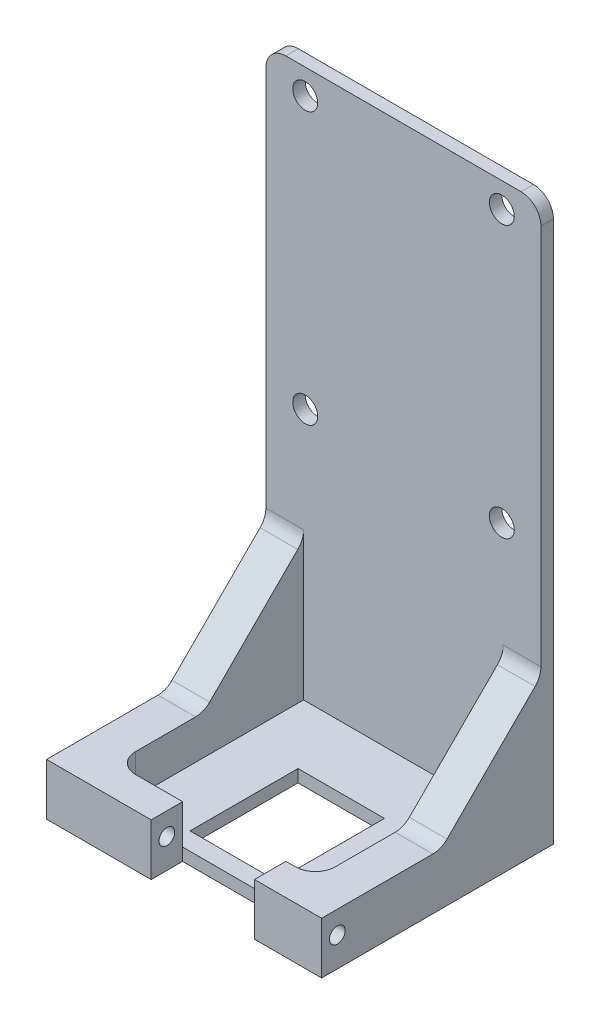
ISO-10303-21;
HEADER;
FILE_DESCRIPTION(('STEP AP214'),'2;1');
FILE_NAME('part.step','',(''),(''),'','','');
FILE_SCHEMA(('AUTOMOTIVE_DESIGN { 1 0 10303 214 1 1 1 1 }'));
ENDSEC;
DATA;
#1=APPLICATION_CONTEXT('core data for automotive mechanical design processes');
#2=APPLICATION_PROTOCOL_DEFINITION('international standard','automotive_design',2000,#1);
#3=PRODUCT_CONTEXT('',#1,'mechanical');
#4=PRODUCT('Part','Part','',(#3));
#5=PRODUCT_RELATED_PRODUCT_CATEGORY('part','',(#4));
#6=PRODUCT_DEFINITION_FORMATION('','',#4);
#7=PRODUCT_DEFINITION_CONTEXT('part definition',#1,'design');
#8=PRODUCT_DEFINITION('design','',#6,#7);
#9=PRODUCT_DEFINITION_SHAPE('','',#8);
#10=(LENGTH_UNIT() NAMED_UNIT(*) SI_UNIT(.MILLI.,.METRE.));
#11=(NAMED_UNIT(*) PLANE_ANGLE_UNIT() SI_UNIT($,.RADIAN.));
#12=(NAMED_UNIT(*) SI_UNIT($,.STERADIAN.) SOLID_ANGLE_UNIT());
#13=UNCERTAINTY_MEASURE_WITH_UNIT(LENGTH_MEASURE(1.E-05),#10,'distance_accuracy_value','');
#14=(GEOMETRIC_REPRESENTATION_CONTEXT(3) GLOBAL_UNCERTAINTY_ASSIGNED_CONTEXT((#13)) GLOBAL_UNIT_ASSIGNED_CONTEXT((#10,
#11,#12)) REPRESENTATION_CONTEXT('',''));
#15=CARTESIAN_POINT('',(0.,0.,0.));
#16=DIRECTION('',(0.,0.,1.));
#17=DIRECTION('',(1.,0.,0.));
#18=AXIS2_PLACEMENT_3D('',#15,#16,#17);
#19=CARTESIAN_POINT('',(0.,3.175,0.));
#20=DIRECTION('',(0.,-1.,0.));
#21=DIRECTION('',(0.,0.,-1.));
#22=AXIS2_PLACEMENT_3D('',#19,#20,#21);
#23=PLANE('',#22);
#24=DIRECTION('',(1.,0.,0.));
#25=VECTOR('',#24,1.);
#26=CARTESIAN_POINT('',(-11.,3.175,17.));
#27=LINE('',#26,#25);
#28=CARTESIAN_POINT('',(-11.,3.175,17.));
#29=VERTEX_POINT('',#28);
#30=CARTESIAN_POINT('',(11.,3.175,17.));
#31=VERTEX_POINT('',#30);
#32=EDGE_CURVE('E239',#29,#31,#27,.T.);
#33=ORIENTED_EDGE('',*,*,#32,.F.);
#34=DIRECTION('',(0.,0.,1.));
#35=VECTOR('',#34,1.);
#36=CARTESIAN_POINT('',(-11.,3.175,17.));
#37=LINE('',#36,#35);
#38=CARTESIAN_POINT('',(-11.,3.175,-10.5));
#39=VERTEX_POINT('',#38);
#40=EDGE_CURVE('E244',#39,#29,#37,.T.);
#41=ORIENTED_EDGE('',*,*,#40,.F.);
#42=DIRECTION('',(-1.,0.,0.));
#43=VECTOR('',#42,1.);
#44=CARTESIAN_POINT('',(-11.,3.175,-10.5));
#45=LINE('',#44,#43);
#46=CARTESIAN_POINT('',(11.,3.175,-10.5));
#47=VERTEX_POINT('',#46);
#48=EDGE_CURVE('E248',#47,#39,#45,.T.);
#49=ORIENTED_EDGE('',*,*,#48,.F.);
#50=DIRECTION('',(0.,0.,-1.));
#51=VECTOR('',#50,1.);
#52=CARTESIAN_POINT('',(11.,3.175,17.));
#53=LINE('',#52,#51);
#54=EDGE_CURVE('E228',#31,#47,#53,.T.);
#55=ORIENTED_EDGE('',*,*,#54,.F.);
#56=EDGE_LOOP('',(#33,#41,#49,#55));
#57=FACE_BOUND('',#56,.T.);
#58=DIRECTION('',(-1.,0.,0.));
#59=VECTOR('',#58,1.);
#60=CARTESIAN_POINT('',(17.907,3.175,21.5));
#61=LINE('',#60,#59);
#62=CARTESIAN_POINT('',(20.327,3.175,21.5));
#63=VERTEX_POINT('',#62);
#64=CARTESIAN_POINT('',(17.907,3.175,21.5));
#65=VERTEX_POINT('',#64);
#66=EDGE_CURVE('E308',#63,#65,#61,.T.);
#67=ORIENTED_EDGE('',*,*,#66,.F.);
#68=CARTESIAN_POINT('',(20.327,3.175,16.42));
#69=DIRECTION('',(0.,-1.,0.));
#70=DIRECTION('',(0.,0.,-1.));
#71=AXIS2_PLACEMENT_3D('',#68,#69,#70);
#72=CIRCLE('',#71,5.08);
#73=CARTESIAN_POINT('',(25.407,3.175,16.42));
#74=VERTEX_POINT('',#73);
#75=EDGE_CURVE('E455',#63,#74,#72,.F.);
#76=ORIENTED_EDGE('',*,*,#75,.T.);
#77=DIRECTION('',(0.,0.,1.));
#78=VECTOR('',#77,1.);
#79=CARTESIAN_POINT('',(25.407,3.175,29.5));
#80=LINE('',#79,#78);
#81=CARTESIAN_POINT('',(25.407,3.175,-26.325));
#82=VERTEX_POINT('',#81);
#83=EDGE_CURVE('E267',#82,#74,#80,.T.);
#84=ORIENTED_EDGE('',*,*,#83,.F.);
#85=DIRECTION('',(1.,0.,0.));
#86=VECTOR('',#85,1.);
#87=CARTESIAN_POINT('',(-35.,3.175,-26.325));
#88=LINE('',#87,#86);
#89=CARTESIAN_POINT('',(-25.407,3.175,-26.325));
#90=VERTEX_POINT('',#89);
#91=EDGE_CURVE('E338',#90,#82,#88,.T.);
#92=ORIENTED_EDGE('',*,*,#91,.F.);
#93=DIRECTION('',(0.,0.,-1.));
#94=VECTOR('',#93,1.);
#95=CARTESIAN_POINT('',(-25.407,3.175,21.5));
#96=LINE('',#95,#94);
#97=CARTESIAN_POINT('',(-25.407,3.175,16.42));
#98=VERTEX_POINT('',#97);
#99=EDGE_CURVE('E255',#98,#90,#96,.T.);
#100=ORIENTED_EDGE('',*,*,#99,.F.);
#101=CARTESIAN_POINT('',(-20.327,3.175,16.42));
#102=DIRECTION('',(0.,-1.,0.));
#103=DIRECTION('',(0.,0.,-1.));
#104=AXIS2_PLACEMENT_3D('',#101,#102,#103);
#105=CIRCLE('',#104,5.08);
#106=CARTESIAN_POINT('',(-20.327,3.175,21.5));
#107=VERTEX_POINT('',#106);
#108=EDGE_CURVE('E453',#98,#107,#105,.F.);
#109=ORIENTED_EDGE('',*,*,#108,.T.);
#110=DIRECTION('',(-1.,0.,0.));
#111=VECTOR('',#110,1.);
#112=CARTESIAN_POINT('',(-15.882,3.175,21.5));
#113=LINE('',#112,#111);
#114=CARTESIAN_POINT('',(-8.382,3.175,21.5));
#115=VERTEX_POINT('',#114);
#116=EDGE_CURVE('E324',#115,#107,#113,.T.);
#117=ORIENTED_EDGE('',*,*,#116,.F.);
#118=DIRECTION('',(-1.,0.,0.));
#119=VECTOR('',#118,1.);
#120=CARTESIAN_POINT('',(-8.382,3.175,21.5));
#121=LINE('',#120,#119);
#122=EDGE_CURVE('E302',#65,#115,#121,.T.);
#123=ORIENTED_EDGE('',*,*,#122,.F.);
#124=EDGE_LOOP('',(#67,#76,#84,#92,#100,#109,#117,#123));
#125=FACE_BOUND('',#124,.T.);
#126=ADVANCED_FACE('F33',(#57,#125),#23,.F.);
#127=CARTESIAN_POINT('',(-35.,142.875,-26.325));
#128=DIRECTION('',(0.,0.,-1.));
#129=DIRECTION('',(-1.,0.,0.));
#130=AXIS2_PLACEMENT_3D('',#127,#128,#129);
#131=PLANE('',#130);
#132=CARTESIAN_POINT('',(25.038,136.525,-26.325));
#133=DIRECTION('',(0.,0.,1.));
#134=DIRECTION('',(1.,0.,0.));
#135=AXIS2_PLACEMENT_3D('',#132,#133,#134);
#136=CIRCLE('',#135,3.175);
#137=CARTESIAN_POINT('',(28.213,136.525,-26.325));
#138=VERTEX_POINT('',#137);
#139=EDGE_CURVE('E274',#138,#138,#136,.T.);
#140=ORIENTED_EDGE('',*,*,#139,.F.);
#141=EDGE_LOOP('',(#140));
#142=FACE_BOUND('',#141,.T.);
#143=CARTESIAN_POINT('',(25.0380000000007,67.437,-26.325));
#144=DIRECTION('',(0.,0.,1.));
#145=DIRECTION('',(1.,0.,0.));
#146=AXIS2_PLACEMENT_3D('',#143,#144,#145);
#147=CIRCLE('',#146,3.175);
#148=CARTESIAN_POINT('',(28.2130000000007,67.437,-26.325));
#149=VERTEX_POINT('',#148);
#150=EDGE_CURVE('E283',#149,#149,#147,.T.);
#151=ORIENTED_EDGE('',*,*,#150,.F.);
#152=EDGE_LOOP('',(#151));
#153=FACE_BOUND('',#152,.T.);
#154=CARTESIAN_POINT('',(-24.9999999999993,67.437,-26.325));
#155=DIRECTION('',(0.,0.,1.));
#156=DIRECTION('',(1.,0.,0.));
#157=AXIS2_PLACEMENT_3D('',#154,#155,#156);
#158=CIRCLE('',#157,3.175);
#159=CARTESIAN_POINT('',(-21.8249999999993,67.437,-26.325));
#160=VERTEX_POINT('',#159);
#161=EDGE_CURVE('E279',#160,#160,#158,.T.);
#162=ORIENTED_EDGE('',*,*,#161,.F.);
#163=EDGE_LOOP('',(#162));
#164=FACE_BOUND('',#163,.T.);
#165=CARTESIAN_POINT('',(-25.,136.525,-26.325));
#166=DIRECTION('',(0.,0.,1.));
#167=DIRECTION('',(1.,0.,0.));
#168=AXIS2_PLACEMENT_3D('',#165,#166,#167);
#169=CIRCLE('',#168,3.175);
#170=CARTESIAN_POINT('',(-21.825,136.525,-26.325));
#171=VERTEX_POINT('',#170);
#172=EDGE_CURVE('E282',#171,#171,#169,.T.);
#173=ORIENTED_EDGE('',*,*,#172,.F.);
#174=EDGE_LOOP('',(#173));
#175=FACE_BOUND('',#174,.T.);
#176=DIRECTION('',(0.,-1.,0.));
#177=VECTOR('',#176,1.);
#178=CARTESIAN_POINT('',(-35.,142.875,-26.325));
#179=LINE('',#178,#177);
#180=CARTESIAN_POINT('',(-35.,137.795,-26.325));
#181=VERTEX_POINT('',#180);
#182=CARTESIAN_POINT('',(-35.,40.6792048968553,-26.325));
#183=VERTEX_POINT('',#182);
#184=EDGE_CURVE('E349',#181,#183,#179,.T.);
#185=ORIENTED_EDGE('',*,*,#184,.T.);
#186=DIRECTION('',(-1.,0.,0.));
#187=VECTOR('',#186,1.);
#188=CARTESIAN_POINT('',(-35.,40.6792048968553,-26.325));
#189=LINE('',#188,#187);
#190=CARTESIAN_POINT('',(-25.407,40.6792048968553,-26.325));
#191=VERTEX_POINT('',#190);
#192=EDGE_CURVE('E419',#183,#191,#189,.F.);
#193=ORIENTED_EDGE('',*,*,#192,.T.);
#194=DIRECTION('',(0.,-1.,0.));
#195=VECTOR('',#194,1.);
#196=CARTESIAN_POINT('',(-25.407,72.1828685346285,-26.325));
#197=LINE('',#196,#195);
#198=EDGE_CURVE('E259',#191,#90,#197,.T.);
#199=ORIENTED_EDGE('',*,*,#198,.T.);
#200=ORIENTED_EDGE('',*,*,#91,.T.);
#201=DIRECTION('',(0.,-1.,0.));
#202=VECTOR('',#201,1.);
#203=CARTESIAN_POINT('',(25.407,72.1828685346285,-26.325));
#204=LINE('',#203,#202);
#205=CARTESIAN_POINT('',(25.407,40.6792048968553,-26.325));
#206=VERTEX_POINT('',#205);
#207=EDGE_CURVE('E262',#206,#82,#204,.T.);
#208=ORIENTED_EDGE('',*,*,#207,.F.);
#209=DIRECTION('',(1.,0.,0.));
#210=VECTOR('',#209,1.);
#211=CARTESIAN_POINT('',(-35.,40.6792048968553,-26.325));
#212=LINE('',#211,#210);
#213=CARTESIAN_POINT('',(35.,40.6792048968553,-26.325));
#214=VERTEX_POINT('',#213);
#215=EDGE_CURVE('E416',#206,#214,#212,.T.);
#216=ORIENTED_EDGE('',*,*,#215,.T.);
#217=DIRECTION('',(0.,-1.,0.));
#218=VECTOR('',#217,1.);
#219=CARTESIAN_POINT('',(35.,142.875,-26.325));
#220=LINE('',#219,#218);
#221=CARTESIAN_POINT('',(35.,137.795,-26.325));
#222=VERTEX_POINT('',#221);
#223=EDGE_CURVE('E345',#222,#214,#220,.T.);
#224=ORIENTED_EDGE('',*,*,#223,.F.);
#225=CARTESIAN_POINT('',(29.92,137.795,-26.325));
#226=DIRECTION('',(0.,0.,-1.));
#227=DIRECTION('',(-1.,0.,0.));
#228=AXIS2_PLACEMENT_3D('',#225,#226,#227);
#229=CIRCLE('',#228,5.08);
#230=CARTESIAN_POINT('',(29.92,142.875,-26.325));
#231=VERTEX_POINT('',#230);
#232=EDGE_CURVE('E407',#222,#231,#229,.F.);
#233=ORIENTED_EDGE('',*,*,#232,.T.);
#234=DIRECTION('',(1.,0.,0.));
#235=VECTOR('',#234,1.);
#236=CARTESIAN_POINT('',(-35.,142.875,-26.325));
#237=LINE('',#236,#235);
#238=CARTESIAN_POINT('',(-29.92,142.875,-26.325));
#239=VERTEX_POINT('',#238);
#240=EDGE_CURVE('E339',#239,#231,#237,.T.);
#241=ORIENTED_EDGE('',*,*,#240,.F.);
#242=CARTESIAN_POINT('',(-29.92,137.795,-26.325));
#243=DIRECTION('',(0.,0.,-1.));
#244=DIRECTION('',(-1.,0.,0.));
#245=AXIS2_PLACEMENT_3D('',#242,#243,#244);
#246=CIRCLE('',#245,5.08);
#247=EDGE_CURVE('E405',#239,#181,#246,.F.);
#248=ORIENTED_EDGE('',*,*,#247,.T.);
#249=EDGE_LOOP('',(#185,#193,#199,#200,#208,#216,#224,#233,#241,#248));
#250=FACE_BOUND('',#249,.T.);
#251=ADVANCED_FACE('F485',(#142,#153,#164,#175,#250),#131,.F.);
#252=CARTESIAN_POINT('',(-35.,3.175,29.5));
#253=DIRECTION('',(0.,0.,-1.));
#254=DIRECTION('',(-1.,0.,0.));
#255=AXIS2_PLACEMENT_3D('',#252,#253,#254);
#256=PLANE('',#255);
#257=DIRECTION('',(1.,0.,0.));
#258=VECTOR('',#257,1.);
#259=CARTESIAN_POINT('',(-35.,0.,29.5));
#260=LINE('',#259,#258);
#261=CARTESIAN_POINT('',(-35.,0.,29.5));
#262=VERTEX_POINT('',#261);
#263=CARTESIAN_POINT('',(-8.38199999999999,0.,29.5));
#264=VERTEX_POINT('',#263);
#265=EDGE_CURVE('E361',#262,#264,#260,.T.);
#266=ORIENTED_EDGE('',*,*,#265,.T.);
#267=DIRECTION('',(0.,-1.,0.));
#268=VECTOR('',#267,1.);
#269=CARTESIAN_POINT('',(-8.38199999999999,13.175,29.5));
#270=LINE('',#269,#268);
#271=CARTESIAN_POINT('',(-8.38199999999999,13.175,29.5));
#272=VERTEX_POINT('',#271);
#273=EDGE_CURVE('E332',#272,#264,#270,.T.);
#274=ORIENTED_EDGE('',*,*,#273,.F.);
#275=DIRECTION('',(1.,0.,0.));
#276=VECTOR('',#275,1.);
#277=CARTESIAN_POINT('',(-15.882,13.175,29.5));
#278=LINE('',#277,#276);
#279=CARTESIAN_POINT('',(-35.,13.175,29.5));
#280=VERTEX_POINT('',#279);
#281=EDGE_CURVE('E330',#280,#272,#278,.T.);
#282=ORIENTED_EDGE('',*,*,#281,.F.);
#283=DIRECTION('',(0.,-1.,0.));
#284=VECTOR('',#283,1.);
#285=CARTESIAN_POINT('',(-35.,3.175,29.5));
#286=LINE('',#285,#284);
#287=EDGE_CURVE('E367',#280,#262,#286,.T.);
#288=ORIENTED_EDGE('',*,*,#287,.T.);
#289=EDGE_LOOP('',(#266,#274,#282,#288));
#290=FACE_BOUND('',#289,.T.);
#291=ADVANCED_FACE('F503',(#290),#256,.F.);
#292=CARTESIAN_POINT('',(35.,3.175,29.5));
#293=DIRECTION('',(-1.,0.,0.));
#294=DIRECTION('',(0.,0.,1.));
#295=AXIS2_PLACEMENT_3D('',#292,#293,#294);
#296=PLANE('',#295);
#297=DIRECTION('',(0.,-1.,0.));
#298=VECTOR('',#297,1.);
#299=CARTESIAN_POINT('',(35.,3.175,-29.5));
#300=LINE('',#299,#298);
#301=CARTESIAN_POINT('',(35.,137.795,-29.5));
#302=VERTEX_POINT('',#301);
#303=CARTESIAN_POINT('',(35.,0.,-29.5));
#304=VERTEX_POINT('',#303);
#305=EDGE_CURVE('E372',#302,#304,#300,.T.);
#306=ORIENTED_EDGE('',*,*,#305,.F.);
#307=DIRECTION('',(0.,0.,-1.));
#308=VECTOR('',#307,1.);
#309=CARTESIAN_POINT('',(35.,137.795,-26.325));
#310=LINE('',#309,#308);
#311=EDGE_CURVE('E403',#302,#222,#310,.F.);
#312=ORIENTED_EDGE('',*,*,#311,.T.);
#313=ORIENTED_EDGE('',*,*,#223,.T.);
#314=CARTESIAN_POINT('',(35.,40.6792048968553,-21.245));
#315=DIRECTION('',(-1.,0.,0.));
#316=DIRECTION('',(0.,0.,1.));
#317=AXIS2_PLACEMENT_3D('',#314,#315,#316);
#318=CIRCLE('',#317,5.08);
#319=CARTESIAN_POINT('',(35.,37.0871024484277,-24.8371024484277));
#320=VERTEX_POINT('',#319);
#321=EDGE_CURVE('E445',#214,#320,#318,.T.);
#322=ORIENTED_EDGE('',*,*,#321,.T.);
#323=DIRECTION('',(0.,-0.707106781186548,0.707106781186547));
#324=VECTOR('',#323,1.);
#325=CARTESIAN_POINT('',(35.,38.575,-26.325));
#326=LINE('',#325,#324);
#327=CARTESIAN_POINT('',(35.,14.6628975515723,-2.41289755157234));
#328=VERTEX_POINT('',#327);
#329=EDGE_CURVE('E559',#320,#328,#326,.T.);
#330=ORIENTED_EDGE('',*,*,#329,.T.);
#331=CARTESIAN_POINT('',(35.,18.255,1.17920489685533));
#332=DIRECTION('',(-1.,0.,0.));
#333=DIRECTION('',(0.,0.,1.));
#334=AXIS2_PLACEMENT_3D('',#331,#332,#333);
#335=CIRCLE('',#334,5.08);
#336=CARTESIAN_POINT('',(35.,13.175,1.17920489685533));
#337=VERTEX_POINT('',#336);
#338=EDGE_CURVE('E441',#328,#337,#335,.T.);
#339=ORIENTED_EDGE('',*,*,#338,.T.);
#340=DIRECTION('',(0.,0.,-1.));
#341=VECTOR('',#340,1.);
#342=CARTESIAN_POINT('',(35.,13.175,29.5));
#343=LINE('',#342,#341);
#344=CARTESIAN_POINT('',(35.,13.175,29.5));
#345=VERTEX_POINT('',#344);
#346=EDGE_CURVE('E271',#345,#337,#343,.T.);
#347=ORIENTED_EDGE('',*,*,#346,.F.);
#348=DIRECTION('',(0.,-1.,0.));
#349=VECTOR('',#348,1.);
#350=CARTESIAN_POINT('',(35.,3.175,29.5));
#351=LINE('',#350,#349);
#352=CARTESIAN_POINT('',(35.,0.,29.5));
#353=VERTEX_POINT('',#352);
#354=EDGE_CURVE('E364',#345,#353,#351,.T.);
#355=ORIENTED_EDGE('',*,*,#354,.T.);
#356=DIRECTION('',(0.,0.,-1.));
#357=VECTOR('',#356,1.);
#358=CARTESIAN_POINT('',(35.,0.,29.5));
#359=LINE('',#358,#357);
#360=EDGE_CURVE('E352',#353,#304,#359,.T.);
#361=ORIENTED_EDGE('',*,*,#360,.T.);
#362=EDGE_LOOP('',(#306,#312,#313,#322,#330,#339,#347,#355,#361));
#363=FACE_BOUND('',#362,.T.);
#364=CARTESIAN_POINT('',(35.,7.475,25.5));
#365=DIRECTION('',(1.,0.,0.));
#366=DIRECTION('',(0.,0.,-1.));
#367=AXIS2_PLACEMENT_3D('',#364,#365,#366);
#368=CIRCLE('',#367,2.);
#369=CARTESIAN_POINT('',(35.,7.475,23.5));
#370=VERTEX_POINT('',#369);
#371=EDGE_CURVE('E573',#370,#370,#368,.T.);
#372=ORIENTED_EDGE('',*,*,#371,.F.);
#373=EDGE_LOOP('',(#372));
#374=FACE_BOUND('',#373,.T.);
#375=ADVANCED_FACE('F524',(#363,#374),#296,.F.);
#376=CARTESIAN_POINT('',(-35.,3.175,-29.5));
#377=DIRECTION('',(0.,0.,1.));
#378=DIRECTION('',(1.,0.,0.));
#379=AXIS2_PLACEMENT_3D('',#376,#377,#378);
#380=PLANE('',#379);
#381=CARTESIAN_POINT('',(25.038,136.525,-29.5));
#382=DIRECTION('',(0.,0.,1.));
#383=DIRECTION('',(1.,0.,0.));
#384=AXIS2_PLACEMENT_3D('',#381,#382,#383);
#385=CIRCLE('',#384,3.175);
#386=CARTESIAN_POINT('',(28.213,136.525,-29.5));
#387=VERTEX_POINT('',#386);
#388=EDGE_CURVE('E299',#387,#387,#385,.T.);
#389=ORIENTED_EDGE('',*,*,#388,.T.);
#390=EDGE_LOOP('',(#389));
#391=FACE_BOUND('',#390,.T.);
#392=CARTESIAN_POINT('',(25.0380000000007,67.437,-29.5));
#393=DIRECTION('',(0.,0.,1.));
#394=DIRECTION('',(1.,0.,0.));
#395=AXIS2_PLACEMENT_3D('',#392,#393,#394);
#396=CIRCLE('',#395,3.175);
#397=CARTESIAN_POINT('',(28.2130000000007,67.437,-29.5));
#398=VERTEX_POINT('',#397);
#399=EDGE_CURVE('E296',#398,#398,#396,.T.);
#400=ORIENTED_EDGE('',*,*,#399,.T.);
#401=EDGE_LOOP('',(#400));
#402=FACE_BOUND('',#401,.T.);
#403=CARTESIAN_POINT('',(-24.9999999999993,67.437,-29.5));
#404=DIRECTION('',(0.,0.,1.));
#405=DIRECTION('',(1.,0.,0.));
#406=AXIS2_PLACEMENT_3D('',#403,#404,#405);
#407=CIRCLE('',#406,3.175);
#408=CARTESIAN_POINT('',(-21.8249999999993,67.437,-29.5));
#409=VERTEX_POINT('',#408);
#410=EDGE_CURVE('E293',#409,#409,#407,.T.);
#411=ORIENTED_EDGE('',*,*,#410,.T.);
#412=EDGE_LOOP('',(#411));
#413=FACE_BOUND('',#412,.T.);
#414=CARTESIAN_POINT('',(-25.,136.525,-29.5));
#415=DIRECTION('',(0.,0.,1.));
#416=DIRECTION('',(1.,0.,0.));
#417=AXIS2_PLACEMENT_3D('',#414,#415,#416);
#418=CIRCLE('',#417,3.175);
#419=CARTESIAN_POINT('',(-21.825,136.525,-29.5));
#420=VERTEX_POINT('',#419);
#421=EDGE_CURVE('E290',#420,#420,#418,.T.);
#422=ORIENTED_EDGE('',*,*,#421,.T.);
#423=EDGE_LOOP('',(#422));
#424=FACE_BOUND('',#423,.T.);
#425=DIRECTION('',(-1.,0.,0.));
#426=VECTOR('',#425,1.);
#427=CARTESIAN_POINT('',(-35.,142.875,-29.5));
#428=LINE('',#427,#426);
#429=CARTESIAN_POINT('',(29.92,142.875,-29.5));
#430=VERTEX_POINT('',#429);
#431=CARTESIAN_POINT('',(-29.92,142.875,-29.5));
#432=VERTEX_POINT('',#431);
#433=EDGE_CURVE('E342',#430,#432,#428,.T.);
#434=ORIENTED_EDGE('',*,*,#433,.F.);
#435=CARTESIAN_POINT('',(29.92,137.795,-29.5));
#436=DIRECTION('',(0.,0.,1.));
#437=DIRECTION('',(1.,0.,0.));
#438=AXIS2_PLACEMENT_3D('',#435,#436,#437);
#439=CIRCLE('',#438,5.08);
#440=EDGE_CURVE('E401',#430,#302,#439,.F.);
#441=ORIENTED_EDGE('',*,*,#440,.T.);
#442=ORIENTED_EDGE('',*,*,#305,.T.);
#443=DIRECTION('',(-1.,0.,0.));
#444=VECTOR('',#443,1.);
#445=CARTESIAN_POINT('',(-35.,0.,-29.5));
#446=LINE('',#445,#444);
#447=CARTESIAN_POINT('',(-35.,0.,-29.5));
#448=VERTEX_POINT('',#447);
#449=EDGE_CURVE('E355',#304,#448,#446,.T.);
#450=ORIENTED_EDGE('',*,*,#449,.T.);
#451=DIRECTION('',(0.,-1.,0.));
#452=VECTOR('',#451,1.);
#453=CARTESIAN_POINT('',(-35.,3.175,-29.5));
#454=LINE('',#453,#452);
#455=CARTESIAN_POINT('',(-35.,137.795,-29.5));
#456=VERTEX_POINT('',#455);
#457=EDGE_CURVE('E370',#456,#448,#454,.T.);
#458=ORIENTED_EDGE('',*,*,#457,.F.);
#459=CARTESIAN_POINT('',(-29.92,137.795,-29.5));
#460=DIRECTION('',(0.,0.,1.));
#461=DIRECTION('',(1.,0.,0.));
#462=AXIS2_PLACEMENT_3D('',#459,#460,#461);
#463=CIRCLE('',#462,5.08);
#464=EDGE_CURVE('E399',#456,#432,#463,.F.);
#465=ORIENTED_EDGE('',*,*,#464,.T.);
#466=EDGE_LOOP('',(#434,#441,#442,#450,#458,#465));
#467=FACE_BOUND('',#466,.T.);
#468=ADVANCED_FACE('F520',(#391,#402,#413,#424,#467),#380,.F.);
#469=CARTESIAN_POINT('',(-35.,3.175,29.5));
#470=DIRECTION('',(1.,0.,0.));
#471=DIRECTION('',(0.,0.,-1.));
#472=AXIS2_PLACEMENT_3D('',#469,#470,#471);
#473=PLANE('',#472);
#474=CARTESIAN_POINT('',(-35.,7.475,25.5));
#475=DIRECTION('',(1.,0.,0.));
#476=DIRECTION('',(0.,0.,-1.));
#477=AXIS2_PLACEMENT_3D('',#474,#475,#476);
#478=CIRCLE('',#477,2.);
#479=CARTESIAN_POINT('',(-35.,7.475,23.5));
#480=VERTEX_POINT('',#479);
#481=EDGE_CURVE('E393',#480,#480,#478,.T.);
#482=ORIENTED_EDGE('',*,*,#481,.T.);
#483=EDGE_LOOP('',(#482));
#484=FACE_BOUND('',#483,.T.);
#485=ORIENTED_EDGE('',*,*,#184,.F.);
#486=DIRECTION('',(0.,0.,1.));
#487=VECTOR('',#486,1.);
#488=CARTESIAN_POINT('',(-35.,137.795,-29.5));
#489=LINE('',#488,#487);
#490=EDGE_CURVE('E409',#181,#456,#489,.F.);
#491=ORIENTED_EDGE('',*,*,#490,.T.);
#492=ORIENTED_EDGE('',*,*,#457,.T.);
#493=DIRECTION('',(0.,0.,1.));
#494=VECTOR('',#493,1.);
#495=CARTESIAN_POINT('',(-35.,0.,29.5));
#496=LINE('',#495,#494);
#497=EDGE_CURVE('E358',#448,#262,#496,.T.);
#498=ORIENTED_EDGE('',*,*,#497,.T.);
#499=ORIENTED_EDGE('',*,*,#287,.F.);
#500=DIRECTION('',(0.,0.,1.));
#501=VECTOR('',#500,1.);
#502=CARTESIAN_POINT('',(-35.,13.175,29.5));
#503=LINE('',#502,#501);
#504=CARTESIAN_POINT('',(-35.,13.175,1.17920489685533));
#505=VERTEX_POINT('',#504);
#506=EDGE_CURVE('E260',#505,#280,#503,.T.);
#507=ORIENTED_EDGE('',*,*,#506,.F.);
#508=CARTESIAN_POINT('',(-35.,18.255,1.17920489685533));
#509=DIRECTION('',(1.,0.,0.));
#510=DIRECTION('',(0.,0.,-1.));
#511=AXIS2_PLACEMENT_3D('',#508,#509,#510);
#512=CIRCLE('',#511,5.08);
#513=CARTESIAN_POINT('',(-35.,14.6628975515723,-2.41289755157233));
#514=VERTEX_POINT('',#513);
#515=EDGE_CURVE('E436',#505,#514,#512,.T.);
#516=ORIENTED_EDGE('',*,*,#515,.T.);
#517=DIRECTION('',(0.,0.707106781186547,-0.707106781186548));
#518=VECTOR('',#517,1.);
#519=CARTESIAN_POINT('',(-35.,38.575,-26.325));
#520=LINE('',#519,#518);
#521=CARTESIAN_POINT('',(-35.,37.0871024484277,-24.8371024484277));
#522=VERTEX_POINT('',#521);
#523=EDGE_CURVE('E565',#514,#522,#520,.T.);
#524=ORIENTED_EDGE('',*,*,#523,.T.);
#525=CARTESIAN_POINT('',(-35.,40.6792048968553,-21.245));
#526=DIRECTION('',(1.,0.,0.));
#527=DIRECTION('',(0.,0.,-1.));
#528=AXIS2_PLACEMENT_3D('',#525,#526,#527);
#529=CIRCLE('',#528,5.08);
#530=EDGE_CURVE('E432',#522,#183,#529,.T.);
#531=ORIENTED_EDGE('',*,*,#530,.T.);
#532=EDGE_LOOP('',(#485,#491,#492,#498,#499,#507,#516,#524,#531));
#533=FACE_BOUND('',#532,.T.);
#534=ADVANCED_FACE('F516',(#484,#533),#473,.F.);
#535=ORIENTED_EDGE('',*,*,#354,.F.);
#536=DIRECTION('',(1.,0.,0.));
#537=VECTOR('',#536,1.);
#538=CARTESIAN_POINT('',(17.907,13.175,29.5));
#539=LINE('',#538,#537);
#540=CARTESIAN_POINT('',(17.907,13.175,29.5));
#541=VERTEX_POINT('',#540);
#542=EDGE_CURVE('E311',#541,#345,#539,.T.);
#543=ORIENTED_EDGE('',*,*,#542,.F.);
#544=DIRECTION('',(0.,-1.,0.));
#545=VECTOR('',#544,1.);
#546=CARTESIAN_POINT('',(17.907,13.175,29.5));
#547=LINE('',#546,#545);
#548=CARTESIAN_POINT('',(17.907,0.,29.5));
#549=VERTEX_POINT('',#548);
#550=EDGE_CURVE('E318',#541,#549,#547,.T.);
#551=ORIENTED_EDGE('',*,*,#550,.T.);
#552=EDGE_CURVE('E360',#549,#353,#260,.T.);
#553=ORIENTED_EDGE('',*,*,#552,.T.);
#554=EDGE_LOOP('',(#535,#543,#551,#553));
#555=FACE_BOUND('',#554,.T.);
#556=ADVANCED_FACE('F512',(#555),#256,.F.);
#557=CARTESIAN_POINT('',(0.,0.,0.));
#558=DIRECTION('',(0.,-1.,0.));
#559=DIRECTION('',(0.,0.,-1.));
#560=AXIS2_PLACEMENT_3D('',#557,#558,#559);
#561=PLANE('',#560);
#562=DIRECTION('',(0.,0.,-1.));
#563=VECTOR('',#562,1.);
#564=CARTESIAN_POINT('',(-11.,0.,0.));
#565=LINE('',#564,#563);
#566=CARTESIAN_POINT('',(-11.,0.,17.));
#567=VERTEX_POINT('',#566);
#568=CARTESIAN_POINT('',(-11.,0.,-10.5));
#569=VERTEX_POINT('',#568);
#570=EDGE_CURVE('E386',#567,#569,#565,.T.);
#571=ORIENTED_EDGE('',*,*,#570,.F.);
#572=DIRECTION('',(-1.,0.,0.));
#573=VECTOR('',#572,1.);
#574=CARTESIAN_POINT('',(0.,0.,17.));
#575=LINE('',#574,#573);
#576=CARTESIAN_POINT('',(11.,0.,17.));
#577=VERTEX_POINT('',#576);
#578=EDGE_CURVE('E381',#577,#567,#575,.T.);
#579=ORIENTED_EDGE('',*,*,#578,.F.);
#580=DIRECTION('',(0.,0.,1.));
#581=VECTOR('',#580,1.);
#582=CARTESIAN_POINT('',(11.,0.,0.));
#583=LINE('',#582,#581);
#584=CARTESIAN_POINT('',(11.,0.,-10.5));
#585=VERTEX_POINT('',#584);
#586=EDGE_CURVE('E231',#585,#577,#583,.T.);
#587=ORIENTED_EDGE('',*,*,#586,.F.);
#588=DIRECTION('',(1.,0.,0.));
#589=VECTOR('',#588,1.);
#590=CARTESIAN_POINT('',(0.,0.,-10.5));
#591=LINE('',#590,#589);
#592=EDGE_CURVE('E384',#569,#585,#591,.T.);
#593=ORIENTED_EDGE('',*,*,#592,.F.);
#594=EDGE_LOOP('',(#571,#579,#587,#593));
#595=FACE_BOUND('',#594,.T.);
#596=DIRECTION('',(0.,0.,-1.));
#597=VECTOR('',#596,1.);
#598=CARTESIAN_POINT('',(-8.382,0.,0.));
#599=LINE('',#598,#597);
#600=CARTESIAN_POINT('',(-8.382,0.,21.5));
#601=VERTEX_POINT('',#600);
#602=EDGE_CURVE('E379',#264,#601,#599,.T.);
#603=ORIENTED_EDGE('',*,*,#602,.F.);
#604=ORIENTED_EDGE('',*,*,#265,.F.);
#605=ORIENTED_EDGE('',*,*,#497,.F.);
#606=ORIENTED_EDGE('',*,*,#449,.F.);
#607=ORIENTED_EDGE('',*,*,#360,.F.);
#608=ORIENTED_EDGE('',*,*,#552,.F.);
#609=DIRECTION('',(0.,0.,1.));
#610=VECTOR('',#609,1.);
#611=CARTESIAN_POINT('',(17.907,0.,0.));
#612=LINE('',#611,#610);
#613=CARTESIAN_POINT('',(17.907,0.,21.5));
#614=VERTEX_POINT('',#613);
#615=EDGE_CURVE('E374',#614,#549,#612,.T.);
#616=ORIENTED_EDGE('',*,*,#615,.F.);
#617=DIRECTION('',(1.,0.,0.));
#618=VECTOR('',#617,1.);
#619=CARTESIAN_POINT('',(0.,0.,21.5));
#620=LINE('',#619,#618);
#621=EDGE_CURVE('E377',#601,#614,#620,.T.);
#622=ORIENTED_EDGE('',*,*,#621,.F.);
#623=EDGE_LOOP('',(#603,#604,#605,#606,#607,#608,#616,#622));
#624=FACE_BOUND('',#623,.T.);
#625=ADVANCED_FACE('F508',(#595,#624),#561,.T.);
#626=CARTESIAN_POINT('',(0.,142.875,0.));
#627=DIRECTION('',(0.,1.,0.));
#628=DIRECTION('',(0.,0.,1.));
#629=AXIS2_PLACEMENT_3D('',#626,#627,#628);
#630=PLANE('',#629);
#631=ORIENTED_EDGE('',*,*,#240,.T.);
#632=DIRECTION('',(0.,0.,-1.));
#633=VECTOR('',#632,1.);
#634=CARTESIAN_POINT('',(29.92,142.875,-29.5));
#635=LINE('',#634,#633);
#636=EDGE_CURVE('E396',#231,#430,#635,.T.);
#637=ORIENTED_EDGE('',*,*,#636,.T.);
#638=ORIENTED_EDGE('',*,*,#433,.T.);
#639=DIRECTION('',(0.,0.,1.));
#640=VECTOR('',#639,1.);
#641=CARTESIAN_POINT('',(-29.92,142.875,-26.325));
#642=LINE('',#641,#640);
#643=EDGE_CURVE('E388',#432,#239,#642,.T.);
#644=ORIENTED_EDGE('',*,*,#643,.T.);
#645=EDGE_LOOP('',(#631,#637,#638,#644));
#646=FACE_BOUND('',#645,.T.);
#647=ADVANCED_FACE('F511',(#646),#630,.T.);
#648=CARTESIAN_POINT('',(-8.382,13.175,21.5));
#649=DIRECTION('',(-1.,0.,0.));
#650=DIRECTION('',(0.,0.,1.));
#651=AXIS2_PLACEMENT_3D('',#648,#649,#650);
#652=PLANE('',#651);
#653=CARTESIAN_POINT('',(-8.38199999999999,7.475,25.5));
#654=DIRECTION('',(-1.,0.,0.));
#655=DIRECTION('',(0.,0.,1.));
#656=AXIS2_PLACEMENT_3D('',#653,#654,#655);
#657=CIRCLE('',#656,2.);
#658=CARTESIAN_POINT('',(-8.38199999999999,7.475,27.5));
#659=VERTEX_POINT('',#658);
#660=EDGE_CURVE('E392',#659,#659,#657,.T.);
#661=ORIENTED_EDGE('',*,*,#660,.T.);
#662=EDGE_LOOP('',(#661));
#663=FACE_BOUND('',#662,.T.);
#664=ORIENTED_EDGE('',*,*,#273,.T.);
#665=ORIENTED_EDGE('',*,*,#602,.T.);
#666=DIRECTION('',(0.,1.,0.));
#667=VECTOR('',#666,1.);
#668=CARTESIAN_POINT('',(-8.382,-6.825,21.5));
#669=LINE('',#668,#667);
#670=EDGE_CURVE('E306',#601,#115,#669,.T.);
#671=ORIENTED_EDGE('',*,*,#670,.T.);
#672=DIRECTION('',(0.,-1.,0.));
#673=VECTOR('',#672,1.);
#674=CARTESIAN_POINT('',(-8.382,13.175,21.5));
#675=LINE('',#674,#673);
#676=CARTESIAN_POINT('',(-8.382,13.175,21.5));
#677=VERTEX_POINT('',#676);
#678=EDGE_CURVE('E335',#677,#115,#675,.T.);
#679=ORIENTED_EDGE('',*,*,#678,.F.);
#680=DIRECTION('',(0.,0.,-1.));
#681=VECTOR('',#680,1.);
#682=CARTESIAN_POINT('',(-8.382,13.175,21.5));
#683=LINE('',#682,#681);
#684=EDGE_CURVE('E325',#272,#677,#683,.T.);
#685=ORIENTED_EDGE('',*,*,#684,.F.);
#686=EDGE_LOOP('',(#664,#665,#671,#679,#685));
#687=FACE_BOUND('',#686,.T.);
#688=ADVANCED_FACE('F619',(#663,#687),#652,.F.);
#689=CARTESIAN_POINT('',(-15.882,13.175,21.5));
#690=DIRECTION('',(0.,0.,1.));
#691=DIRECTION('',(1.,0.,0.));
#692=AXIS2_PLACEMENT_3D('',#689,#690,#691);
#693=PLANE('',#692);
#694=ORIENTED_EDGE('',*,*,#116,.T.);
#695=DIRECTION('',(0.,-1.,0.));
#696=VECTOR('',#695,1.);
#697=CARTESIAN_POINT('',(-20.327,13.175,21.5));
#698=LINE('',#697,#696);
#699=CARTESIAN_POINT('',(-20.327,13.175,21.5));
#700=VERTEX_POINT('',#699);
#701=EDGE_CURVE('E48',#107,#700,#698,.F.);
#702=ORIENTED_EDGE('',*,*,#701,.T.);
#703=DIRECTION('',(-1.,0.,0.));
#704=VECTOR('',#703,1.);
#705=CARTESIAN_POINT('',(-15.882,13.175,21.5));
#706=LINE('',#705,#704);
#707=EDGE_CURVE('E328',#677,#700,#706,.T.);
#708=ORIENTED_EDGE('',*,*,#707,.F.);
#709=ORIENTED_EDGE('',*,*,#678,.T.);
#710=EDGE_LOOP('',(#694,#702,#708,#709));
#711=FACE_BOUND('',#710,.T.);
#712=ADVANCED_FACE('F618',(#711),#693,.F.);
#713=CARTESIAN_POINT('',(0.,13.175,0.));
#714=DIRECTION('',(0.,1.,0.));
#715=DIRECTION('',(0.,0.,1.));
#716=AXIS2_PLACEMENT_3D('',#713,#714,#715);
#717=PLANE('',#716);
#718=ORIENTED_EDGE('',*,*,#707,.T.);
#719=CARTESIAN_POINT('',(-20.327,13.175,16.42));
#720=DIRECTION('',(0.,1.,0.));
#721=DIRECTION('',(0.,0.,1.));
#722=AXIS2_PLACEMENT_3D('',#719,#720,#721);
#723=CIRCLE('',#722,5.08);
#724=CARTESIAN_POINT('',(-25.407,13.175,16.42));
#725=VERTEX_POINT('',#724);
#726=EDGE_CURVE('E11',#700,#725,#723,.F.);
#727=ORIENTED_EDGE('',*,*,#726,.T.);
#728=DIRECTION('',(0.,0.,-1.));
#729=VECTOR('',#728,1.);
#730=CARTESIAN_POINT('',(-25.407,13.175,21.5));
#731=LINE('',#730,#729);
#732=CARTESIAN_POINT('',(-25.407,13.175,1.17920489685533));
#733=VERTEX_POINT('',#732);
#734=EDGE_CURVE('E263',#725,#733,#731,.T.);
#735=ORIENTED_EDGE('',*,*,#734,.T.);
#736=DIRECTION('',(-1.,0.,0.));
#737=VECTOR('',#736,1.);
#738=CARTESIAN_POINT('',(-35.,13.175,1.17920489685533));
#739=LINE('',#738,#737);
#740=EDGE_CURVE('E422',#733,#505,#739,.T.);
#741=ORIENTED_EDGE('',*,*,#740,.T.);
#742=ORIENTED_EDGE('',*,*,#506,.T.);
#743=ORIENTED_EDGE('',*,*,#281,.T.);
#744=ORIENTED_EDGE('',*,*,#684,.T.);
#745=EDGE_LOOP('',(#718,#727,#735,#741,#742,#743,#744));
#746=FACE_BOUND('',#745,.T.);
#747=ADVANCED_FACE('F620',(#746),#717,.T.);
#748=CARTESIAN_POINT('',(17.907,13.175,21.5));
#749=DIRECTION('',(0.,0.,1.));
#750=DIRECTION('',(1.,0.,0.));
#751=AXIS2_PLACEMENT_3D('',#748,#749,#750);
#752=PLANE('',#751);
#753=DIRECTION('',(-1.,0.,0.));
#754=VECTOR('',#753,1.);
#755=CARTESIAN_POINT('',(17.907,13.175,21.5));
#756=LINE('',#755,#754);
#757=CARTESIAN_POINT('',(20.327,13.175,21.5));
#758=VERTEX_POINT('',#757);
#759=CARTESIAN_POINT('',(17.907,13.175,21.5));
#760=VERTEX_POINT('',#759);
#761=EDGE_CURVE('E314',#758,#760,#756,.T.);
#762=ORIENTED_EDGE('',*,*,#761,.F.);
#763=DIRECTION('',(0.,-1.,0.));
#764=VECTOR('',#763,1.);
#765=CARTESIAN_POINT('',(20.327,3.175,21.5));
#766=LINE('',#765,#764);
#767=EDGE_CURVE('E450',#758,#63,#766,.T.);
#768=ORIENTED_EDGE('',*,*,#767,.T.);
#769=ORIENTED_EDGE('',*,*,#66,.T.);
#770=DIRECTION('',(0.,-1.,0.));
#771=VECTOR('',#770,1.);
#772=CARTESIAN_POINT('',(17.907,13.175,21.5));
#773=LINE('',#772,#771);
#774=EDGE_CURVE('E321',#760,#65,#773,.T.);
#775=ORIENTED_EDGE('',*,*,#774,.F.);
#776=EDGE_LOOP('',(#762,#768,#769,#775));
#777=FACE_BOUND('',#776,.T.);
#778=ADVANCED_FACE('F472',(#777),#752,.F.);
#779=CARTESIAN_POINT('',(17.907,13.175,21.5));
#780=DIRECTION('',(1.,0.,0.));
#781=DIRECTION('',(0.,0.,-1.));
#782=AXIS2_PLACEMENT_3D('',#779,#780,#781);
#783=PLANE('',#782);
#784=CARTESIAN_POINT('',(17.907,7.475,25.5));
#785=DIRECTION('',(1.,0.,0.));
#786=DIRECTION('',(0.,0.,-1.));
#787=AXIS2_PLACEMENT_3D('',#784,#785,#786);
#788=CIRCLE('',#787,2.);
#789=CARTESIAN_POINT('',(17.907,7.475,23.5));
#790=VERTEX_POINT('',#789);
#791=EDGE_CURVE('E389',#790,#790,#788,.T.);
#792=ORIENTED_EDGE('',*,*,#791,.T.);
#793=EDGE_LOOP('',(#792));
#794=FACE_BOUND('',#793,.T.);
#795=ORIENTED_EDGE('',*,*,#774,.T.);
#796=DIRECTION('',(0.,1.,0.));
#797=VECTOR('',#796,1.);
#798=CARTESIAN_POINT('',(17.907,-6.825,21.5));
#799=LINE('',#798,#797);
#800=EDGE_CURVE('E305',#614,#65,#799,.T.);
#801=ORIENTED_EDGE('',*,*,#800,.F.);
#802=ORIENTED_EDGE('',*,*,#615,.T.);
#803=ORIENTED_EDGE('',*,*,#550,.F.);
#804=DIRECTION('',(0.,0.,1.));
#805=VECTOR('',#804,1.);
#806=CARTESIAN_POINT('',(17.907,13.175,21.5));
#807=LINE('',#806,#805);
#808=EDGE_CURVE('E316',#760,#541,#807,.T.);
#809=ORIENTED_EDGE('',*,*,#808,.F.);
#810=EDGE_LOOP('',(#795,#801,#802,#803,#809));
#811=FACE_BOUND('',#810,.T.);
#812=ADVANCED_FACE('F613',(#794,#811),#783,.F.);
#813=CARTESIAN_POINT('',(0.,13.175,0.));
#814=DIRECTION('',(0.,-1.,0.));
#815=DIRECTION('',(0.,0.,-1.));
#816=AXIS2_PLACEMENT_3D('',#813,#814,#815);
#817=PLANE('',#816);
#818=ORIENTED_EDGE('',*,*,#346,.T.);
#819=DIRECTION('',(1.,0.,0.));
#820=VECTOR('',#819,1.);
#821=CARTESIAN_POINT('',(0.,13.175,1.17920489685533));
#822=LINE('',#821,#820);
#823=CARTESIAN_POINT('',(25.407,13.175,1.17920489685533));
#824=VERTEX_POINT('',#823);
#825=EDGE_CURVE('E430',#337,#824,#822,.F.);
#826=ORIENTED_EDGE('',*,*,#825,.T.);
#827=DIRECTION('',(0.,0.,1.));
#828=VECTOR('',#827,1.);
#829=CARTESIAN_POINT('',(25.407,13.175,29.5));
#830=LINE('',#829,#828);
#831=CARTESIAN_POINT('',(25.407,13.175,16.42));
#832=VERTEX_POINT('',#831);
#833=EDGE_CURVE('E270',#824,#832,#830,.T.);
#834=ORIENTED_EDGE('',*,*,#833,.T.);
#835=CARTESIAN_POINT('',(20.327,13.175,16.42));
#836=DIRECTION('',(0.,-1.,0.));
#837=DIRECTION('',(0.,0.,-1.));
#838=AXIS2_PLACEMENT_3D('',#835,#836,#837);
#839=CIRCLE('',#838,5.08);
#840=EDGE_CURVE('E41',#832,#758,#839,.T.);
#841=ORIENTED_EDGE('',*,*,#840,.T.);
#842=ORIENTED_EDGE('',*,*,#761,.T.);
#843=ORIENTED_EDGE('',*,*,#808,.T.);
#844=ORIENTED_EDGE('',*,*,#542,.T.);
#845=EDGE_LOOP('',(#818,#826,#834,#841,#842,#843,#844));
#846=FACE_BOUND('',#845,.T.);
#847=ADVANCED_FACE('F465',(#846),#817,.F.);
#848=CARTESIAN_POINT('',(-8.382,-6.825,21.5));
#849=DIRECTION('',(0.,0.,-1.));
#850=DIRECTION('',(-1.,0.,0.));
#851=AXIS2_PLACEMENT_3D('',#848,#849,#850);
#852=PLANE('',#851);
#853=ORIENTED_EDGE('',*,*,#621,.T.);
#854=ORIENTED_EDGE('',*,*,#800,.T.);
#855=ORIENTED_EDGE('',*,*,#122,.T.);
#856=ORIENTED_EDGE('',*,*,#670,.F.);
#857=EDGE_LOOP('',(#853,#854,#855,#856));
#858=FACE_BOUND('',#857,.T.);
#859=ADVANCED_FACE('F616',(#858),#852,.F.);
#860=CARTESIAN_POINT('',(-25.,136.525,-166.025));
#861=DIRECTION('',(0.,0.,1.));
#862=DIRECTION('',(1.,0.,0.));
#863=AXIS2_PLACEMENT_3D('',#860,#861,#862);
#864=CYLINDRICAL_SURFACE('',#863,3.175);
#865=ORIENTED_EDGE('',*,*,#172,.T.);
#866=EDGE_LOOP('',(#865));
#867=FACE_BOUND('',#866,.T.);
#868=ORIENTED_EDGE('',*,*,#421,.F.);
#869=EDGE_LOOP('',(#868));
#870=FACE_BOUND('',#869,.T.);
#871=ADVANCED_FACE('F659',(#867,#870),#864,.F.);
#872=CARTESIAN_POINT('',(-24.9999999999993,67.437,-166.025));
#873=DIRECTION('',(0.,0.,1.));
#874=DIRECTION('',(1.,0.,0.));
#875=AXIS2_PLACEMENT_3D('',#872,#873,#874);
#876=CYLINDRICAL_SURFACE('',#875,3.175);
#877=ORIENTED_EDGE('',*,*,#161,.T.);
#878=EDGE_LOOP('',(#877));
#879=FACE_BOUND('',#878,.T.);
#880=ORIENTED_EDGE('',*,*,#410,.F.);
#881=EDGE_LOOP('',(#880));
#882=FACE_BOUND('',#881,.T.);
#883=ADVANCED_FACE('F662',(#879,#882),#876,.F.);
#884=CARTESIAN_POINT('',(25.0380000000007,67.437,-166.025));
#885=DIRECTION('',(0.,0.,1.));
#886=DIRECTION('',(1.,0.,0.));
#887=AXIS2_PLACEMENT_3D('',#884,#885,#886);
#888=CYLINDRICAL_SURFACE('',#887,3.175);
#889=ORIENTED_EDGE('',*,*,#150,.T.);
#890=EDGE_LOOP('',(#889));
#891=FACE_BOUND('',#890,.T.);
#892=ORIENTED_EDGE('',*,*,#399,.F.);
#893=EDGE_LOOP('',(#892));
#894=FACE_BOUND('',#893,.T.);
#895=ADVANCED_FACE('F667',(#891,#894),#888,.F.);
#896=CARTESIAN_POINT('',(25.038,136.525,-166.025));
#897=DIRECTION('',(0.,0.,1.));
#898=DIRECTION('',(1.,0.,0.));
#899=AXIS2_PLACEMENT_3D('',#896,#897,#898);
#900=CYLINDRICAL_SURFACE('',#899,3.175);
#901=ORIENTED_EDGE('',*,*,#139,.T.);
#902=EDGE_LOOP('',(#901));
#903=FACE_BOUND('',#902,.T.);
#904=ORIENTED_EDGE('',*,*,#388,.F.);
#905=EDGE_LOOP('',(#904));
#906=FACE_BOUND('',#905,.T.);
#907=ADVANCED_FACE('F664',(#903,#906),#900,.F.);
#908=CARTESIAN_POINT('',(25.407,72.1828685346285,29.5));
#909=DIRECTION('',(1.,0.,0.));
#910=DIRECTION('',(0.,0.,-1.));
#911=AXIS2_PLACEMENT_3D('',#908,#909,#910);
#912=PLANE('',#911);
#913=ORIENTED_EDGE('',*,*,#83,.T.);
#914=DIRECTION('',(0.,-1.,0.));
#915=VECTOR('',#914,1.);
#916=CARTESIAN_POINT('',(25.407,13.175,16.42));
#917=LINE('',#916,#915);
#918=EDGE_CURVE('E457',#74,#832,#917,.F.);
#919=ORIENTED_EDGE('',*,*,#918,.T.);
#920=ORIENTED_EDGE('',*,*,#833,.F.);
#921=CARTESIAN_POINT('',(25.407,18.255,1.17920489685533));
#922=DIRECTION('',(1.,0.,0.));
#923=DIRECTION('',(0.,0.,-1.));
#924=AXIS2_PLACEMENT_3D('',#921,#922,#923);
#925=CIRCLE('',#924,5.08);
#926=CARTESIAN_POINT('',(25.407,14.6628975515723,-2.41289755157233));
#927=VERTEX_POINT('',#926);
#928=EDGE_CURVE('E443',#824,#927,#925,.T.);
#929=ORIENTED_EDGE('',*,*,#928,.T.);
#930=DIRECTION('',(0.,0.707106781186548,-0.707106781186547));
#931=VECTOR('',#930,1.);
#932=CARTESIAN_POINT('',(25.407,38.575,-26.325));
#933=LINE('',#932,#931);
#934=CARTESIAN_POINT('',(25.407,37.0871024484277,-24.8371024484277));
#935=VERTEX_POINT('',#934);
#936=EDGE_CURVE('E563',#927,#935,#933,.T.);
#937=ORIENTED_EDGE('',*,*,#936,.T.);
#938=CARTESIAN_POINT('',(25.407,40.6792048968553,-21.245));
#939=DIRECTION('',(1.,0.,0.));
#940=DIRECTION('',(0.,0.,-1.));
#941=AXIS2_PLACEMENT_3D('',#938,#939,#940);
#942=CIRCLE('',#941,5.08);
#943=EDGE_CURVE('E447',#935,#206,#942,.T.);
#944=ORIENTED_EDGE('',*,*,#943,.T.);
#945=ORIENTED_EDGE('',*,*,#207,.T.);
#946=EDGE_LOOP('',(#913,#919,#920,#929,#937,#944,#945));
#947=FACE_BOUND('',#946,.T.);
#948=ADVANCED_FACE('F480',(#947),#912,.F.);
#949=CARTESIAN_POINT('',(-25.407,72.1828685346285,21.5));
#950=DIRECTION('',(-1.,0.,0.));
#951=DIRECTION('',(0.,0.,1.));
#952=AXIS2_PLACEMENT_3D('',#949,#950,#951);
#953=PLANE('',#952);
#954=ORIENTED_EDGE('',*,*,#734,.F.);
#955=DIRECTION('',(0.,-1.,0.));
#956=VECTOR('',#955,1.);
#957=CARTESIAN_POINT('',(-25.407,3.175,16.42));
#958=LINE('',#957,#956);
#959=EDGE_CURVE('E459',#725,#98,#958,.T.);
#960=ORIENTED_EDGE('',*,*,#959,.T.);
#961=ORIENTED_EDGE('',*,*,#99,.T.);
#962=ORIENTED_EDGE('',*,*,#198,.F.);
#963=CARTESIAN_POINT('',(-25.407,40.6792048968553,-21.245));
#964=DIRECTION('',(-1.,0.,0.));
#965=DIRECTION('',(0.,0.,1.));
#966=AXIS2_PLACEMENT_3D('',#963,#964,#965);
#967=CIRCLE('',#966,5.08);
#968=CARTESIAN_POINT('',(-25.407,37.0871024484277,-24.8371024484277));
#969=VERTEX_POINT('',#968);
#970=EDGE_CURVE('E434',#191,#969,#967,.T.);
#971=ORIENTED_EDGE('',*,*,#970,.T.);
#972=DIRECTION('',(0.,-0.707106781186547,0.707106781186548));
#973=VECTOR('',#972,1.);
#974=CARTESIAN_POINT('',(-25.407,38.575,-26.325));
#975=LINE('',#974,#973);
#976=CARTESIAN_POINT('',(-25.407,14.6628975515723,-2.41289755157233));
#977=VERTEX_POINT('',#976);
#978=EDGE_CURVE('E570',#969,#977,#975,.T.);
#979=ORIENTED_EDGE('',*,*,#978,.T.);
#980=CARTESIAN_POINT('',(-25.407,18.255,1.17920489685533));
#981=DIRECTION('',(-1.,0.,0.));
#982=DIRECTION('',(0.,0.,1.));
#983=AXIS2_PLACEMENT_3D('',#980,#981,#982);
#984=CIRCLE('',#983,5.08);
#985=EDGE_CURVE('E438',#977,#733,#984,.T.);
#986=ORIENTED_EDGE('',*,*,#985,.T.);
#987=EDGE_LOOP('',(#954,#960,#961,#962,#971,#979,#986));
#988=FACE_BOUND('',#987,.T.);
#989=ADVANCED_FACE('F490',(#988),#953,.F.);
#990=CARTESIAN_POINT('',(-11.,-6.825,17.));
#991=DIRECTION('',(-1.,0.,0.));
#992=DIRECTION('',(0.,0.,1.));
#993=AXIS2_PLACEMENT_3D('',#990,#991,#992);
#994=PLANE('',#993);
#995=ORIENTED_EDGE('',*,*,#570,.T.);
#996=DIRECTION('',(0.,1.,0.));
#997=VECTOR('',#996,1.);
#998=CARTESIAN_POINT('',(-11.,-6.825,-10.5));
#999=LINE('',#998,#997);
#1000=EDGE_CURVE('E253',#569,#39,#999,.T.);
#1001=ORIENTED_EDGE('',*,*,#1000,.T.);
#1002=ORIENTED_EDGE('',*,*,#40,.T.);
#1003=DIRECTION('',(0.,1.,0.));
#1004=VECTOR('',#1003,1.);
#1005=CARTESIAN_POINT('',(-11.,-6.825,17.));
#1006=LINE('',#1005,#1004);
#1007=EDGE_CURVE('E235',#567,#29,#1006,.T.);
#1008=ORIENTED_EDGE('',*,*,#1007,.F.);
#1009=EDGE_LOOP('',(#995,#1001,#1002,#1008));
#1010=FACE_BOUND('',#1009,.T.);
#1011=ADVANCED_FACE('F580',(#1010),#994,.F.);
#1012=CARTESIAN_POINT('',(-11.,-6.825,-10.5));
#1013=DIRECTION('',(0.,0.,-1.));
#1014=DIRECTION('',(-1.,0.,0.));
#1015=AXIS2_PLACEMENT_3D('',#1012,#1013,#1014);
#1016=PLANE('',#1015);
#1017=ORIENTED_EDGE('',*,*,#592,.T.);
#1018=DIRECTION('',(0.,1.,0.));
#1019=VECTOR('',#1018,1.);
#1020=CARTESIAN_POINT('',(11.,-6.825,-10.5));
#1021=LINE('',#1020,#1019);
#1022=EDGE_CURVE('E234',#585,#47,#1021,.T.);
#1023=ORIENTED_EDGE('',*,*,#1022,.T.);
#1024=ORIENTED_EDGE('',*,*,#48,.T.);
#1025=ORIENTED_EDGE('',*,*,#1000,.F.);
#1026=EDGE_LOOP('',(#1017,#1023,#1024,#1025));
#1027=FACE_BOUND('',#1026,.T.);
#1028=ADVANCED_FACE('F585',(#1027),#1016,.F.);
#1029=CARTESIAN_POINT('',(11.,-6.825,17.));
#1030=DIRECTION('',(1.,0.,0.));
#1031=DIRECTION('',(0.,0.,-1.));
#1032=AXIS2_PLACEMENT_3D('',#1029,#1030,#1031);
#1033=PLANE('',#1032);
#1034=ORIENTED_EDGE('',*,*,#586,.T.);
#1035=DIRECTION('',(0.,1.,0.));
#1036=VECTOR('',#1035,1.);
#1037=CARTESIAN_POINT('',(11.,-6.825,17.));
#1038=LINE('',#1037,#1036);
#1039=EDGE_CURVE('E223',#577,#31,#1038,.T.);
#1040=ORIENTED_EDGE('',*,*,#1039,.T.);
#1041=ORIENTED_EDGE('',*,*,#54,.T.);
#1042=ORIENTED_EDGE('',*,*,#1022,.F.);
#1043=EDGE_LOOP('',(#1034,#1040,#1041,#1042));
#1044=FACE_BOUND('',#1043,.T.);
#1045=ADVANCED_FACE('F225',(#1044),#1033,.F.);
#1046=CARTESIAN_POINT('',(-11.,-6.825,17.));
#1047=DIRECTION('',(0.,0.,1.));
#1048=DIRECTION('',(1.,0.,0.));
#1049=AXIS2_PLACEMENT_3D('',#1046,#1047,#1048);
#1050=PLANE('',#1049);
#1051=ORIENTED_EDGE('',*,*,#578,.T.);
#1052=ORIENTED_EDGE('',*,*,#1007,.T.);
#1053=ORIENTED_EDGE('',*,*,#32,.T.);
#1054=ORIENTED_EDGE('',*,*,#1039,.F.);
#1055=EDGE_LOOP('',(#1051,#1052,#1053,#1054));
#1056=FACE_BOUND('',#1055,.T.);
#1057=ADVANCED_FACE('F240',(#1056),#1050,.F.);
#1058=CARTESIAN_POINT('',(-35.,7.475,25.5));
#1059=DIRECTION('',(1.,0.,0.));
#1060=DIRECTION('',(0.,0.,-1.));
#1061=AXIS2_PLACEMENT_3D('',#1058,#1059,#1060);
#1062=CYLINDRICAL_SURFACE('',#1061,2.);
#1063=ORIENTED_EDGE('',*,*,#371,.T.);
#1064=EDGE_LOOP('',(#1063));
#1065=FACE_BOUND('',#1064,.T.);
#1066=ORIENTED_EDGE('',*,*,#791,.F.);
#1067=EDGE_LOOP('',(#1066));
#1068=FACE_BOUND('',#1067,.T.);
#1069=ADVANCED_FACE('F683',(#1065,#1068),#1062,.F.);
#1070=ORIENTED_EDGE('',*,*,#481,.F.);
#1071=EDGE_LOOP('',(#1070));
#1072=FACE_BOUND('',#1071,.T.);
#1073=ORIENTED_EDGE('',*,*,#660,.F.);
#1074=EDGE_LOOP('',(#1073));
#1075=FACE_BOUND('',#1074,.T.);
#1076=ADVANCED_FACE('F688',(#1072,#1075),#1062,.F.);
#1077=CARTESIAN_POINT('',(10.5140244842766,38.575,-26.325));
#1078=DIRECTION('',(0.,0.707106781186548,0.707106781186547));
#1079=DIRECTION('',(0.,-0.707106781186547,0.707106781186548));
#1080=AXIS2_PLACEMENT_3D('',#1077,#1078,#1079);
#1081=PLANE('',#1080);
#1082=ORIENTED_EDGE('',*,*,#978,.F.);
#1083=DIRECTION('',(-1.,0.,0.));
#1084=VECTOR('',#1083,1.);
#1085=CARTESIAN_POINT('',(10.5140244842766,37.0871024484277,-24.8371024484277));
#1086=LINE('',#1085,#1084);
#1087=EDGE_CURVE('E413',#969,#522,#1086,.T.);
#1088=ORIENTED_EDGE('',*,*,#1087,.T.);
#1089=ORIENTED_EDGE('',*,*,#523,.F.);
#1090=DIRECTION('',(-1.,0.,0.));
#1091=VECTOR('',#1090,1.);
#1092=CARTESIAN_POINT('',(-25.407,14.6628975515723,-2.41289755157233));
#1093=LINE('',#1092,#1091);
#1094=EDGE_CURVE('E411',#514,#977,#1093,.F.);
#1095=ORIENTED_EDGE('',*,*,#1094,.T.);
#1096=EDGE_LOOP('',(#1082,#1088,#1089,#1095));
#1097=FACE_BOUND('',#1096,.T.);
#1098=ADVANCED_FACE('F627',(#1097),#1081,.T.);
#1099=CARTESIAN_POINT('',(-10.5140244842766,38.575,-26.325));
#1100=DIRECTION('',(0.,0.707106781186547,0.707106781186548));
#1101=DIRECTION('',(0.,-0.707106781186548,0.707106781186547));
#1102=AXIS2_PLACEMENT_3D('',#1099,#1100,#1101);
#1103=PLANE('',#1102);
#1104=ORIENTED_EDGE('',*,*,#936,.F.);
#1105=DIRECTION('',(1.,0.,0.));
#1106=VECTOR('',#1105,1.);
#1107=CARTESIAN_POINT('',(-10.5140244842766,14.6628975515723,-2.41289755157233));
#1108=LINE('',#1107,#1106);
#1109=EDGE_CURVE('E427',#927,#328,#1108,.T.);
#1110=ORIENTED_EDGE('',*,*,#1109,.T.);
#1111=ORIENTED_EDGE('',*,*,#329,.F.);
#1112=DIRECTION('',(1.,0.,0.));
#1113=VECTOR('',#1112,1.);
#1114=CARTESIAN_POINT('',(-10.5140244842766,37.0871024484277,-24.8371024484277));
#1115=LINE('',#1114,#1113);
#1116=EDGE_CURVE('E425',#320,#935,#1115,.F.);
#1117=ORIENTED_EDGE('',*,*,#1116,.T.);
#1118=EDGE_LOOP('',(#1104,#1110,#1111,#1117));
#1119=FACE_BOUND('',#1118,.T.);
#1120=ADVANCED_FACE('F533',(#1119),#1103,.T.);
#1121=CARTESIAN_POINT('',(29.92,137.795,0.));
#1122=DIRECTION('',(0.,0.,1.));
#1123=DIRECTION('',(1.,0.,0.));
#1124=AXIS2_PLACEMENT_3D('',#1121,#1122,#1123);
#1125=CYLINDRICAL_SURFACE('',#1124,5.08);
#1126=ORIENTED_EDGE('',*,*,#232,.F.);
#1127=ORIENTED_EDGE('',*,*,#311,.F.);
#1128=ORIENTED_EDGE('',*,*,#440,.F.);
#1129=ORIENTED_EDGE('',*,*,#636,.F.);
#1130=EDGE_LOOP('',(#1126,#1127,#1128,#1129));
#1131=FACE_BOUND('',#1130,.T.);
#1132=ADVANCED_FACE('F529',(#1131),#1125,.T.);
#1133=CARTESIAN_POINT('',(-29.92,137.795,0.));
#1134=DIRECTION('',(0.,0.,-1.));
#1135=DIRECTION('',(-1.,0.,0.));
#1136=AXIS2_PLACEMENT_3D('',#1133,#1134,#1135);
#1137=CYLINDRICAL_SURFACE('',#1136,5.08);
#1138=ORIENTED_EDGE('',*,*,#464,.F.);
#1139=ORIENTED_EDGE('',*,*,#490,.F.);
#1140=ORIENTED_EDGE('',*,*,#247,.F.);
#1141=ORIENTED_EDGE('',*,*,#643,.F.);
#1142=EDGE_LOOP('',(#1138,#1139,#1140,#1141));
#1143=FACE_BOUND('',#1142,.T.);
#1144=ADVANCED_FACE('F532',(#1143),#1137,.T.);
#1145=CARTESIAN_POINT('',(10.5140244842766,40.6792048968553,-21.245));
#1146=DIRECTION('',(-1.,0.,0.));
#1147=DIRECTION('',(0.,0.,1.));
#1148=AXIS2_PLACEMENT_3D('',#1145,#1146,#1147);
#1149=CYLINDRICAL_SURFACE('',#1148,5.08);
#1150=ORIENTED_EDGE('',*,*,#970,.F.);
#1151=ORIENTED_EDGE('',*,*,#192,.F.);
#1152=ORIENTED_EDGE('',*,*,#530,.F.);
#1153=ORIENTED_EDGE('',*,*,#1087,.F.);
#1154=EDGE_LOOP('',(#1150,#1151,#1152,#1153));
#1155=FACE_BOUND('',#1154,.T.);
#1156=ADVANCED_FACE('F537',(#1155),#1149,.F.);
#1157=CARTESIAN_POINT('',(0.,18.255,1.17920489685533));
#1158=DIRECTION('',(1.,0.,0.));
#1159=DIRECTION('',(0.,0.,-1.));
#1160=AXIS2_PLACEMENT_3D('',#1157,#1158,#1159);
#1161=CYLINDRICAL_SURFACE('',#1160,5.08);
#1162=ORIENTED_EDGE('',*,*,#985,.F.);
#1163=ORIENTED_EDGE('',*,*,#1094,.F.);
#1164=ORIENTED_EDGE('',*,*,#515,.F.);
#1165=ORIENTED_EDGE('',*,*,#740,.F.);
#1166=EDGE_LOOP('',(#1162,#1163,#1164,#1165));
#1167=FACE_BOUND('',#1166,.T.);
#1168=ADVANCED_FACE('F541',(#1167),#1161,.F.);
#1169=CARTESIAN_POINT('',(-10.5140244842766,18.255,1.17920489685533));
#1170=DIRECTION('',(1.,0.,0.));
#1171=DIRECTION('',(0.,0.,-1.));
#1172=AXIS2_PLACEMENT_3D('',#1169,#1170,#1171);
#1173=CYLINDRICAL_SURFACE('',#1172,5.08);
#1174=ORIENTED_EDGE('',*,*,#928,.F.);
#1175=ORIENTED_EDGE('',*,*,#825,.F.);
#1176=ORIENTED_EDGE('',*,*,#338,.F.);
#1177=ORIENTED_EDGE('',*,*,#1109,.F.);
#1178=EDGE_LOOP('',(#1174,#1175,#1176,#1177));
#1179=FACE_BOUND('',#1178,.T.);
#1180=ADVANCED_FACE('F545',(#1179),#1173,.F.);
#1181=CARTESIAN_POINT('',(-35.,40.6792048968553,-21.245));
#1182=DIRECTION('',(1.,0.,0.));
#1183=DIRECTION('',(0.,0.,-1.));
#1184=AXIS2_PLACEMENT_3D('',#1181,#1182,#1183);
#1185=CYLINDRICAL_SURFACE('',#1184,5.08);
#1186=ORIENTED_EDGE('',*,*,#943,.F.);
#1187=ORIENTED_EDGE('',*,*,#1116,.F.);
#1188=ORIENTED_EDGE('',*,*,#321,.F.);
#1189=ORIENTED_EDGE('',*,*,#215,.F.);
#1190=EDGE_LOOP('',(#1186,#1187,#1188,#1189));
#1191=FACE_BOUND('',#1190,.T.);
#1192=ADVANCED_FACE('F497',(#1191),#1185,.F.);
#1193=CARTESIAN_POINT('',(20.327,13.175,16.42));
#1194=DIRECTION('',(0.,1.,0.));
#1195=DIRECTION('',(0.,0.,1.));
#1196=AXIS2_PLACEMENT_3D('',#1193,#1194,#1195);
#1197=CYLINDRICAL_SURFACE('',#1196,5.08);
#1198=ORIENTED_EDGE('',*,*,#840,.F.);
#1199=ORIENTED_EDGE('',*,*,#918,.F.);
#1200=ORIENTED_EDGE('',*,*,#75,.F.);
#1201=ORIENTED_EDGE('',*,*,#767,.F.);
#1202=EDGE_LOOP('',(#1198,#1199,#1200,#1201));
#1203=FACE_BOUND('',#1202,.T.);
#1204=ADVANCED_FACE('F475',(#1203),#1197,.F.);
#1205=CARTESIAN_POINT('',(-20.327,72.1828685346285,16.42));
#1206=DIRECTION('',(0.,1.,0.));
#1207=DIRECTION('',(0.,0.,1.));
#1208=AXIS2_PLACEMENT_3D('',#1205,#1206,#1207);
#1209=CYLINDRICAL_SURFACE('',#1208,5.08);
#1210=ORIENTED_EDGE('',*,*,#726,.F.);
#1211=ORIENTED_EDGE('',*,*,#701,.F.);
#1212=ORIENTED_EDGE('',*,*,#108,.F.);
#1213=ORIENTED_EDGE('',*,*,#959,.F.);
#1214=EDGE_LOOP('',(#1210,#1211,#1212,#1213));
#1215=FACE_BOUND('',#1214,.T.);
#1216=ADVANCED_FACE('F35',(#1215),#1209,.F.);
#1217=CLOSED_SHELL('',(#126,#251,#291,#375,#468,#534,#556,#625,#647,#688,#712,#747,#778,#812,
#847,#859,#871,#883,#895,#907,#948,#989,#1011,#1028,#1045,#1057,#1069,#1076,#1098,#1120,#1132,
#1144,#1156,#1168,#1180,#1192,#1204,#1216));
#1218=MANIFOLD_SOLID_BREP('B2',#1217);
#1219=ADVANCED_BREP_SHAPE_REPRESENTATION('',(#18,#1218),#14);
#1220=SHAPE_DEFINITION_REPRESENTATION(#9,#1219);
ENDSEC;
END-ISO-10303-21;
